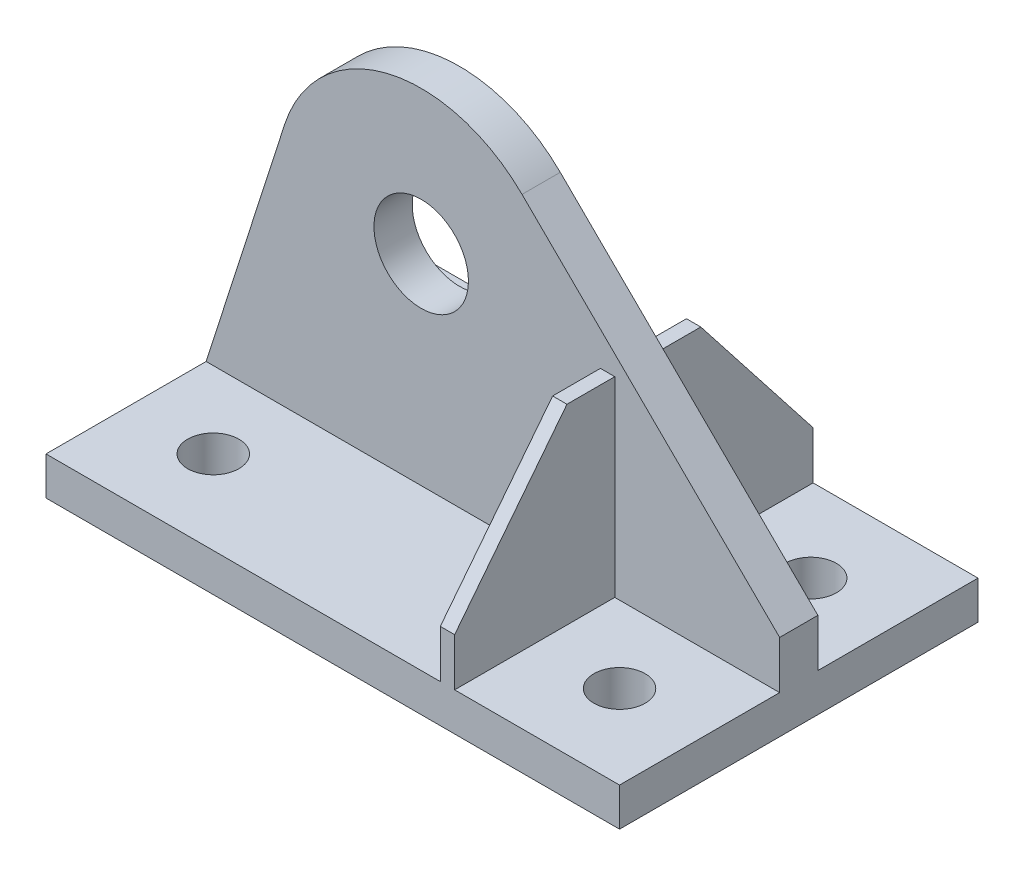
ISO-10303-21;
HEADER;
FILE_DESCRIPTION(('STEP AP214'),'2;1');
FILE_NAME('part.step','',(''),(''),'','','');
FILE_SCHEMA(('AUTOMOTIVE_DESIGN { 1 0 10303 214 1 1 1 1 }'));
ENDSEC;
DATA;
#1=APPLICATION_CONTEXT('core data for automotive mechanical design processes');
#2=APPLICATION_PROTOCOL_DEFINITION('international standard','automotive_design',2000,#1);
#3=PRODUCT_CONTEXT('',#1,'mechanical');
#4=PRODUCT('Part','Part','',(#3));
#5=PRODUCT_RELATED_PRODUCT_CATEGORY('part','',(#4));
#6=PRODUCT_DEFINITION_FORMATION('','',#4);
#7=PRODUCT_DEFINITION_CONTEXT('part definition',#1,'design');
#8=PRODUCT_DEFINITION('design','',#6,#7);
#9=PRODUCT_DEFINITION_SHAPE('','',#8);
#10=(LENGTH_UNIT() NAMED_UNIT(*) SI_UNIT(.MILLI.,.METRE.));
#11=(NAMED_UNIT(*) PLANE_ANGLE_UNIT() SI_UNIT($,.RADIAN.));
#12=(NAMED_UNIT(*) SI_UNIT($,.STERADIAN.) SOLID_ANGLE_UNIT());
#13=UNCERTAINTY_MEASURE_WITH_UNIT(LENGTH_MEASURE(1.E-05),#10,'distance_accuracy_value','');
#14=(GEOMETRIC_REPRESENTATION_CONTEXT(3) GLOBAL_UNCERTAINTY_ASSIGNED_CONTEXT((#13)) GLOBAL_UNIT_ASSIGNED_CONTEXT((#10,
#11,#12)) REPRESENTATION_CONTEXT('',''));
#15=CARTESIAN_POINT('',(0.,0.,0.));
#16=DIRECTION('',(0.,0.,1.));
#17=DIRECTION('',(1.,0.,0.));
#18=AXIS2_PLACEMENT_3D('',#15,#16,#17);
#19=CARTESIAN_POINT('',(0.,16.,0.));
#20=DIRECTION('',(0.,-1.,0.));
#21=DIRECTION('',(0.,0.,-1.));
#22=AXIS2_PLACEMENT_3D('',#19,#20,#21);
#23=PLANE('',#22);
#24=CARTESIAN_POINT('',(35.,16.,-35.));
#25=DIRECTION('',(0.,1.,0.));
#26=DIRECTION('',(0.,0.,1.));
#27=AXIS2_PLACEMENT_3D('',#24,#25,#26);
#28=CIRCLE('',#27,10.7283019020512);
#29=CARTESIAN_POINT('',(35.,16.,-24.2716980979488));
#30=VERTEX_POINT('',#29);
#31=EDGE_CURVE('E275',#30,#30,#28,.T.);
#32=ORIENTED_EDGE('',*,*,#31,.F.);
#33=EDGE_LOOP('',(#32));
#34=FACE_BOUND('',#33,.T.);
#35=DIRECTION('',(1.,0.,0.));
#36=VECTOR('',#35,1.);
#37=CARTESIAN_POINT('',(0.,16.,-67.));
#38=LINE('',#37,#36);
#39=CARTESIAN_POINT('',(0.,16.,-67.));
#40=VERTEX_POINT('',#39);
#41=CARTESIAN_POINT('',(165.,16.,-67.));
#42=VERTEX_POINT('',#41);
#43=EDGE_CURVE('E203',#40,#42,#38,.T.);
#44=ORIENTED_EDGE('',*,*,#43,.F.);
#45=DIRECTION('',(0.,0.,1.));
#46=VECTOR('',#45,1.);
#47=CARTESIAN_POINT('',(0.,16.,0.));
#48=LINE('',#47,#46);
#49=CARTESIAN_POINT('',(0.,16.,0.));
#50=VERTEX_POINT('',#49);
#51=EDGE_CURVE('E270',#40,#50,#48,.T.);
#52=ORIENTED_EDGE('',*,*,#51,.T.);
#53=DIRECTION('',(1.,0.,0.));
#54=VECTOR('',#53,1.);
#55=CARTESIAN_POINT('',(0.,16.,0.));
#56=LINE('',#55,#54);
#57=CARTESIAN_POINT('',(165.,16.,0.));
#58=VERTEX_POINT('',#57);
#59=EDGE_CURVE('E285',#50,#58,#56,.T.);
#60=ORIENTED_EDGE('',*,*,#59,.T.);
#61=DIRECTION('',(0.,0.,1.));
#62=VECTOR('',#61,1.);
#63=CARTESIAN_POINT('',(165.,16.,-150.));
#64=LINE('',#63,#62);
#65=EDGE_CURVE('E232',#42,#58,#64,.T.);
#66=ORIENTED_EDGE('',*,*,#65,.F.);
#67=EDGE_LOOP('',(#44,#52,#60,#66));
#68=FACE_BOUND('',#67,.T.);
#69=ADVANCED_FACE('F34',(#34,#68),#23,.F.);
#70=CARTESIAN_POINT('',(35.,16.,-115.));
#71=DIRECTION('',(0.,1.,0.));
#72=DIRECTION('',(0.,0.,1.));
#73=AXIS2_PLACEMENT_3D('',#70,#71,#72);
#74=CIRCLE('',#73,10.7283019020512);
#75=CARTESIAN_POINT('',(35.,16.,-104.271698097949));
#76=VERTEX_POINT('',#75);
#77=EDGE_CURVE('E296',#76,#76,#74,.T.);
#78=ORIENTED_EDGE('',*,*,#77,.F.);
#79=EDGE_LOOP('',(#78));
#80=FACE_BOUND('',#79,.T.);
#81=DIRECTION('',(-1.,0.,0.));
#82=VECTOR('',#81,1.);
#83=CARTESIAN_POINT('',(0.,16.,-83.));
#84=LINE('',#83,#82);
#85=CARTESIAN_POINT('',(165.,16.,-83.));
#86=VERTEX_POINT('',#85);
#87=CARTESIAN_POINT('',(0.,16.,-83.));
#88=VERTEX_POINT('',#87);
#89=EDGE_CURVE('E205',#86,#88,#84,.T.);
#90=ORIENTED_EDGE('',*,*,#89,.F.);
#91=CARTESIAN_POINT('',(165.,16.,-150.));
#92=VERTEX_POINT('',#91);
#93=EDGE_CURVE('E248',#92,#86,#64,.T.);
#94=ORIENTED_EDGE('',*,*,#93,.F.);
#95=DIRECTION('',(-1.,0.,0.));
#96=VECTOR('',#95,1.);
#97=CARTESIAN_POINT('',(0.,16.,-150.));
#98=LINE('',#97,#96);
#99=CARTESIAN_POINT('',(0.,16.,-150.));
#100=VERTEX_POINT('',#99);
#101=EDGE_CURVE('E321',#92,#100,#98,.T.);
#102=ORIENTED_EDGE('',*,*,#101,.T.);
#103=EDGE_CURVE('E266',#100,#88,#48,.T.);
#104=ORIENTED_EDGE('',*,*,#103,.T.);
#105=EDGE_LOOP('',(#90,#94,#102,#104));
#106=FACE_BOUND('',#105,.T.);
#107=ADVANCED_FACE('F389',(#80,#106),#23,.F.);
#108=CARTESIAN_POINT('',(205.,16.,-35.));
#109=DIRECTION('',(0.,1.,0.));
#110=DIRECTION('',(0.,0.,1.));
#111=AXIS2_PLACEMENT_3D('',#108,#109,#110);
#112=CIRCLE('',#111,10.7283019020512);
#113=CARTESIAN_POINT('',(205.,16.,-24.2716980979488));
#114=VERTEX_POINT('',#113);
#115=EDGE_CURVE('E374',#114,#114,#112,.T.);
#116=ORIENTED_EDGE('',*,*,#115,.F.);
#117=EDGE_LOOP('',(#116));
#118=FACE_BOUND('',#117,.T.);
#119=CARTESIAN_POINT('',(171.,16.,-67.));
#120=VERTEX_POINT('',#119);
#121=CARTESIAN_POINT('',(240.,16.,-67.));
#122=VERTEX_POINT('',#121);
#123=EDGE_CURVE('E202',#120,#122,#38,.T.);
#124=ORIENTED_EDGE('',*,*,#123,.F.);
#125=DIRECTION('',(0.,0.,-1.));
#126=VECTOR('',#125,1.);
#127=CARTESIAN_POINT('',(171.,16.,-150.));
#128=LINE('',#127,#126);
#129=CARTESIAN_POINT('',(171.,16.,0.));
#130=VERTEX_POINT('',#129);
#131=EDGE_CURVE('E364',#130,#120,#128,.T.);
#132=ORIENTED_EDGE('',*,*,#131,.F.);
#133=CARTESIAN_POINT('',(240.,16.,0.));
#134=VERTEX_POINT('',#133);
#135=EDGE_CURVE('E269',#130,#134,#56,.T.);
#136=ORIENTED_EDGE('',*,*,#135,.T.);
#137=DIRECTION('',(0.,0.,-1.));
#138=VECTOR('',#137,1.);
#139=CARTESIAN_POINT('',(240.,16.,0.));
#140=LINE('',#139,#138);
#141=EDGE_CURVE('E279',#134,#122,#140,.T.);
#142=ORIENTED_EDGE('',*,*,#141,.T.);
#143=EDGE_LOOP('',(#124,#132,#136,#142));
#144=FACE_BOUND('',#143,.T.);
#145=ADVANCED_FACE('F433',(#118,#144),#23,.F.);
#146=CARTESIAN_POINT('',(205.,16.,-115.));
#147=DIRECTION('',(0.,1.,0.));
#148=DIRECTION('',(0.,0.,1.));
#149=AXIS2_PLACEMENT_3D('',#146,#147,#148);
#150=CIRCLE('',#149,10.7283019020512);
#151=CARTESIAN_POINT('',(205.,16.,-104.271698097949));
#152=VERTEX_POINT('',#151);
#153=EDGE_CURVE('E289',#152,#152,#150,.T.);
#154=ORIENTED_EDGE('',*,*,#153,.F.);
#155=EDGE_LOOP('',(#154));
#156=FACE_BOUND('',#155,.T.);
#157=CARTESIAN_POINT('',(240.,16.,-83.));
#158=VERTEX_POINT('',#157);
#159=CARTESIAN_POINT('',(171.,16.,-83.));
#160=VERTEX_POINT('',#159);
#161=EDGE_CURVE('E206',#158,#160,#84,.T.);
#162=ORIENTED_EDGE('',*,*,#161,.F.);
#163=CARTESIAN_POINT('',(240.,16.,-150.));
#164=VERTEX_POINT('',#163);
#165=EDGE_CURVE('E288',#158,#164,#140,.T.);
#166=ORIENTED_EDGE('',*,*,#165,.T.);
#167=CARTESIAN_POINT('',(171.,16.,-150.));
#168=VERTEX_POINT('',#167);
#169=EDGE_CURVE('E263',#164,#168,#98,.T.);
#170=ORIENTED_EDGE('',*,*,#169,.T.);
#171=EDGE_CURVE('E254',#160,#168,#128,.T.);
#172=ORIENTED_EDGE('',*,*,#171,.F.);
#173=EDGE_LOOP('',(#162,#166,#170,#172));
#174=FACE_BOUND('',#173,.T.);
#175=ADVANCED_FACE('F338',(#156,#174),#23,.F.);
#176=CARTESIAN_POINT('',(165.,96.,-150.));
#177=DIRECTION('',(1.,0.,0.));
#178=DIRECTION('',(0.,0.,-1.));
#179=AXIS2_PLACEMENT_3D('',#176,#177,#178);
#180=PLANE('',#179);
#181=DIRECTION('',(0.,1.,0.));
#182=VECTOR('',#181,1.);
#183=CARTESIAN_POINT('',(165.,96.,-67.));
#184=LINE('',#183,#182);
#185=CARTESIAN_POINT('',(165.,96.,-67.));
#186=VERTEX_POINT('',#185);
#187=EDGE_CURVE('E216',#42,#186,#184,.T.);
#188=ORIENTED_EDGE('',*,*,#187,.F.);
#189=ORIENTED_EDGE('',*,*,#65,.T.);
#190=DIRECTION('',(0.,-1.,0.));
#191=VECTOR('',#190,1.);
#192=CARTESIAN_POINT('',(165.,96.,0.));
#193=LINE('',#192,#191);
#194=CARTESIAN_POINT('',(165.,36.,0.));
#195=VERTEX_POINT('',#194);
#196=EDGE_CURVE('E354',#195,#58,#193,.T.);
#197=ORIENTED_EDGE('',*,*,#196,.F.);
#198=DIRECTION('',(0.,-0.787228053528989,0.616661975264374));
#199=VECTOR('',#198,1.);
#200=CARTESIAN_POINT('',(165.,96.,-47.));
#201=LINE('',#200,#199);
#202=CARTESIAN_POINT('',(165.,96.,-47.));
#203=VERTEX_POINT('',#202);
#204=EDGE_CURVE('E224',#203,#195,#201,.T.);
#205=ORIENTED_EDGE('',*,*,#204,.F.);
#206=DIRECTION('',(0.,0.,1.));
#207=VECTOR('',#206,1.);
#208=CARTESIAN_POINT('',(165.,96.,-150.));
#209=LINE('',#208,#207);
#210=EDGE_CURVE('E237',#186,#203,#209,.T.);
#211=ORIENTED_EDGE('',*,*,#210,.F.);
#212=EDGE_LOOP('',(#188,#189,#197,#205,#211));
#213=FACE_BOUND('',#212,.T.);
#214=ADVANCED_FACE('F430',(#213),#180,.F.);
#215=DIRECTION('',(0.,-1.,0.));
#216=VECTOR('',#215,1.);
#217=CARTESIAN_POINT('',(165.,96.,-83.));
#218=LINE('',#217,#216);
#219=CARTESIAN_POINT('',(165.,96.,-83.));
#220=VERTEX_POINT('',#219);
#221=EDGE_CURVE('E212',#220,#86,#218,.T.);
#222=ORIENTED_EDGE('',*,*,#221,.F.);
#223=CARTESIAN_POINT('',(165.,96.,-103.));
#224=VERTEX_POINT('',#223);
#225=EDGE_CURVE('E233',#224,#220,#209,.T.);
#226=ORIENTED_EDGE('',*,*,#225,.F.);
#227=DIRECTION('',(0.,0.787228053528989,0.616661975264374));
#228=VECTOR('',#227,1.);
#229=CARTESIAN_POINT('',(165.,96.,-103.));
#230=LINE('',#229,#228);
#231=CARTESIAN_POINT('',(165.,36.,-150.));
#232=VERTEX_POINT('',#231);
#233=EDGE_CURVE('E58',#232,#224,#230,.T.);
#234=ORIENTED_EDGE('',*,*,#233,.F.);
#235=DIRECTION('',(0.,-1.,0.));
#236=VECTOR('',#235,1.);
#237=CARTESIAN_POINT('',(165.,96.,-150.));
#238=LINE('',#237,#236);
#239=EDGE_CURVE('E241',#232,#92,#238,.T.);
#240=ORIENTED_EDGE('',*,*,#239,.T.);
#241=ORIENTED_EDGE('',*,*,#93,.T.);
#242=EDGE_LOOP('',(#222,#226,#234,#240,#241));
#243=FACE_BOUND('',#242,.T.);
#244=ADVANCED_FACE('F413',(#243),#180,.F.);
#245=CARTESIAN_POINT('',(171.,96.,-150.));
#246=DIRECTION('',(-1.,0.,0.));
#247=DIRECTION('',(0.,0.,1.));
#248=AXIS2_PLACEMENT_3D('',#245,#246,#247);
#249=PLANE('',#248);
#250=DIRECTION('',(0.,-1.,0.));
#251=VECTOR('',#250,1.);
#252=CARTESIAN_POINT('',(171.,96.,-67.));
#253=LINE('',#252,#251);
#254=CARTESIAN_POINT('',(171.,96.,-67.));
#255=VERTEX_POINT('',#254);
#256=EDGE_CURVE('E214',#255,#120,#253,.T.);
#257=ORIENTED_EDGE('',*,*,#256,.F.);
#258=DIRECTION('',(0.,0.,-1.));
#259=VECTOR('',#258,1.);
#260=CARTESIAN_POINT('',(171.,96.,-150.));
#261=LINE('',#260,#259);
#262=CARTESIAN_POINT('',(171.,96.,-47.));
#263=VERTEX_POINT('',#262);
#264=EDGE_CURVE('E238',#263,#255,#261,.T.);
#265=ORIENTED_EDGE('',*,*,#264,.F.);
#266=DIRECTION('',(0.,-0.787228053528989,0.616661975264374));
#267=VECTOR('',#266,1.);
#268=CARTESIAN_POINT('',(171.,146.00172146669,-86.1680151489069));
#269=LINE('',#268,#267);
#270=CARTESIAN_POINT('',(171.,36.,0.));
#271=VERTEX_POINT('',#270);
#272=EDGE_CURVE('E229',#263,#271,#269,.T.);
#273=ORIENTED_EDGE('',*,*,#272,.T.);
#274=DIRECTION('',(0.,-1.,0.));
#275=VECTOR('',#274,1.);
#276=CARTESIAN_POINT('',(171.,96.,0.));
#277=LINE('',#276,#275);
#278=EDGE_CURVE('E352',#271,#130,#277,.T.);
#279=ORIENTED_EDGE('',*,*,#278,.T.);
#280=ORIENTED_EDGE('',*,*,#131,.T.);
#281=EDGE_LOOP('',(#257,#265,#273,#279,#280));
#282=FACE_BOUND('',#281,.T.);
#283=ADVANCED_FACE('F432',(#282),#249,.F.);
#284=DIRECTION('',(0.,1.,0.));
#285=VECTOR('',#284,1.);
#286=CARTESIAN_POINT('',(171.,96.,-83.));
#287=LINE('',#286,#285);
#288=CARTESIAN_POINT('',(171.,96.,-83.));
#289=VERTEX_POINT('',#288);
#290=EDGE_CURVE('E50',#160,#289,#287,.T.);
#291=ORIENTED_EDGE('',*,*,#290,.F.);
#292=ORIENTED_EDGE('',*,*,#171,.T.);
#293=DIRECTION('',(0.,-1.,0.));
#294=VECTOR('',#293,1.);
#295=CARTESIAN_POINT('',(171.,96.,-150.));
#296=LINE('',#295,#294);
#297=CARTESIAN_POINT('',(171.,36.,-150.));
#298=VERTEX_POINT('',#297);
#299=EDGE_CURVE('E350',#298,#168,#296,.T.);
#300=ORIENTED_EDGE('',*,*,#299,.F.);
#301=DIRECTION('',(0.,0.787228053528989,0.616661975264374));
#302=VECTOR('',#301,1.);
#303=CARTESIAN_POINT('',(171.,73.1836804957824,-120.872783611637));
#304=LINE('',#303,#302);
#305=CARTESIAN_POINT('',(171.,96.,-103.));
#306=VERTEX_POINT('',#305);
#307=EDGE_CURVE('E221',#298,#306,#304,.T.);
#308=ORIENTED_EDGE('',*,*,#307,.T.);
#309=EDGE_CURVE('E236',#289,#306,#261,.T.);
#310=ORIENTED_EDGE('',*,*,#309,.F.);
#311=EDGE_LOOP('',(#291,#292,#300,#308,#310));
#312=FACE_BOUND('',#311,.T.);
#313=ADVANCED_FACE('F483',(#312),#249,.F.);
#314=CARTESIAN_POINT('',(0.,96.,0.));
#315=DIRECTION('',(0.,1.,0.));
#316=DIRECTION('',(0.,0.,1.));
#317=AXIS2_PLACEMENT_3D('',#314,#315,#316);
#318=PLANE('',#317);
#319=ORIENTED_EDGE('',*,*,#264,.T.);
#320=DIRECTION('',(-1.,0.,0.));
#321=VECTOR('',#320,1.);
#322=CARTESIAN_POINT('',(0.,96.,-67.));
#323=LINE('',#322,#321);
#324=EDGE_CURVE('E258',#255,#186,#323,.T.);
#325=ORIENTED_EDGE('',*,*,#324,.T.);
#326=ORIENTED_EDGE('',*,*,#210,.T.);
#327=DIRECTION('',(-1.,0.,0.));
#328=VECTOR('',#327,1.);
#329=CARTESIAN_POINT('',(0.,96.,-47.));
#330=LINE('',#329,#328);
#331=EDGE_CURVE('E292',#263,#203,#330,.T.);
#332=ORIENTED_EDGE('',*,*,#331,.F.);
#333=EDGE_LOOP('',(#319,#325,#326,#332));
#334=FACE_BOUND('',#333,.T.);
#335=ADVANCED_FACE('F424',(#334),#318,.T.);
#336=ORIENTED_EDGE('',*,*,#225,.T.);
#337=DIRECTION('',(1.,0.,0.));
#338=VECTOR('',#337,1.);
#339=CARTESIAN_POINT('',(0.,96.,-83.));
#340=LINE('',#339,#338);
#341=EDGE_CURVE('E431',#220,#289,#340,.T.);
#342=ORIENTED_EDGE('',*,*,#341,.T.);
#343=ORIENTED_EDGE('',*,*,#309,.T.);
#344=DIRECTION('',(1.,0.,0.));
#345=VECTOR('',#344,1.);
#346=CARTESIAN_POINT('',(0.,96.,-103.));
#347=LINE('',#346,#345);
#348=EDGE_CURVE('E359',#224,#306,#347,.T.);
#349=ORIENTED_EDGE('',*,*,#348,.F.);
#350=EDGE_LOOP('',(#336,#342,#343,#349));
#351=FACE_BOUND('',#350,.T.);
#352=ADVANCED_FACE('F455',(#351),#318,.T.);
#353=CARTESIAN_POINT('',(0.,16.,0.));
#354=DIRECTION('',(1.,0.,0.));
#355=DIRECTION('',(0.,0.,-1.));
#356=AXIS2_PLACEMENT_3D('',#353,#354,#355);
#357=PLANE('',#356);
#358=ORIENTED_EDGE('',*,*,#51,.F.);
#359=DIRECTION('',(0.,0.,1.));
#360=VECTOR('',#359,1.);
#361=CARTESIAN_POINT('',(0.,16.,-150.00005));
#362=LINE('',#361,#360);
#363=EDGE_CURVE('E197',#88,#40,#362,.T.);
#364=ORIENTED_EDGE('',*,*,#363,.F.);
#365=ORIENTED_EDGE('',*,*,#103,.F.);
#366=DIRECTION('',(0.,-1.,0.));
#367=VECTOR('',#366,1.);
#368=CARTESIAN_POINT('',(0.,16.,-150.));
#369=LINE('',#368,#367);
#370=CARTESIAN_POINT('',(0.,0.,-150.));
#371=VERTEX_POINT('',#370);
#372=EDGE_CURVE('E259',#100,#371,#369,.T.);
#373=ORIENTED_EDGE('',*,*,#372,.T.);
#374=DIRECTION('',(0.,0.,1.));
#375=VECTOR('',#374,1.);
#376=CARTESIAN_POINT('',(0.,0.,0.));
#377=LINE('',#376,#375);
#378=CARTESIAN_POINT('',(0.,0.,0.));
#379=VERTEX_POINT('',#378);
#380=EDGE_CURVE('E315',#371,#379,#377,.T.);
#381=ORIENTED_EDGE('',*,*,#380,.T.);
#382=DIRECTION('',(0.,-1.,0.));
#383=VECTOR('',#382,1.);
#384=CARTESIAN_POINT('',(0.,16.,0.));
#385=LINE('',#384,#383);
#386=EDGE_CURVE('E302',#50,#379,#385,.T.);
#387=ORIENTED_EDGE('',*,*,#386,.F.);
#388=EDGE_LOOP('',(#358,#364,#365,#373,#381,#387));
#389=FACE_BOUND('',#388,.T.);
#390=ADVANCED_FACE('F398',(#389),#357,.F.);
#391=CARTESIAN_POINT('',(0.,16.,0.));
#392=DIRECTION('',(0.,0.,-1.));
#393=DIRECTION('',(-1.,0.,0.));
#394=AXIS2_PLACEMENT_3D('',#391,#392,#393);
#395=PLANE('',#394);
#396=ORIENTED_EDGE('',*,*,#278,.F.);
#397=DIRECTION('',(-1.,0.,0.));
#398=VECTOR('',#397,1.);
#399=CARTESIAN_POINT('',(240.000025,36.,0.));
#400=LINE('',#399,#398);
#401=EDGE_CURVE('E226',#271,#195,#400,.T.);
#402=ORIENTED_EDGE('',*,*,#401,.T.);
#403=ORIENTED_EDGE('',*,*,#196,.T.);
#404=ORIENTED_EDGE('',*,*,#59,.F.);
#405=ORIENTED_EDGE('',*,*,#386,.T.);
#406=DIRECTION('',(1.,0.,0.));
#407=VECTOR('',#406,1.);
#408=CARTESIAN_POINT('',(0.,0.,0.));
#409=LINE('',#408,#407);
#410=CARTESIAN_POINT('',(240.,0.,0.));
#411=VERTEX_POINT('',#410);
#412=EDGE_CURVE('E313',#379,#411,#409,.T.);
#413=ORIENTED_EDGE('',*,*,#412,.T.);
#414=DIRECTION('',(0.,-1.,0.));
#415=VECTOR('',#414,1.);
#416=CARTESIAN_POINT('',(240.,16.,0.));
#417=LINE('',#416,#415);
#418=EDGE_CURVE('E305',#134,#411,#417,.T.);
#419=ORIENTED_EDGE('',*,*,#418,.F.);
#420=ORIENTED_EDGE('',*,*,#135,.F.);
#421=EDGE_LOOP('',(#396,#402,#403,#404,#405,#413,#419,#420));
#422=FACE_BOUND('',#421,.T.);
#423=ADVANCED_FACE('F403',(#422),#395,.F.);
#424=CARTESIAN_POINT('',(240.,16.,0.));
#425=DIRECTION('',(-1.,0.,0.));
#426=DIRECTION('',(0.,0.,1.));
#427=AXIS2_PLACEMENT_3D('',#424,#425,#426);
#428=PLANE('',#427);
#429=DIRECTION('',(0.,-1.,0.));
#430=VECTOR('',#429,1.);
#431=CARTESIAN_POINT('',(240.,160.,-83.));
#432=LINE('',#431,#430);
#433=CARTESIAN_POINT('',(240.,36.,-83.));
#434=VERTEX_POINT('',#433);
#435=EDGE_CURVE('E208',#434,#158,#432,.T.);
#436=ORIENTED_EDGE('',*,*,#435,.F.);
#437=DIRECTION('',(0.,0.,1.));
#438=VECTOR('',#437,1.);
#439=CARTESIAN_POINT('',(240.,36.,-150.00025));
#440=LINE('',#439,#438);
#441=CARTESIAN_POINT('',(240.,36.,-67.));
#442=VERTEX_POINT('',#441);
#443=EDGE_CURVE('E178',#434,#442,#440,.T.);
#444=ORIENTED_EDGE('',*,*,#443,.T.);
#445=DIRECTION('',(0.,-1.,0.));
#446=VECTOR('',#445,1.);
#447=CARTESIAN_POINT('',(240.,160.,-67.));
#448=LINE('',#447,#446);
#449=EDGE_CURVE('E189',#442,#122,#448,.T.);
#450=ORIENTED_EDGE('',*,*,#449,.T.);
#451=ORIENTED_EDGE('',*,*,#141,.F.);
#452=ORIENTED_EDGE('',*,*,#418,.T.);
#453=DIRECTION('',(0.,0.,-1.));
#454=VECTOR('',#453,1.);
#455=CARTESIAN_POINT('',(240.,0.,0.));
#456=LINE('',#455,#454);
#457=CARTESIAN_POINT('',(240.,0.,-150.));
#458=VERTEX_POINT('',#457);
#459=EDGE_CURVE('E311',#411,#458,#456,.T.);
#460=ORIENTED_EDGE('',*,*,#459,.T.);
#461=DIRECTION('',(0.,-1.,0.));
#462=VECTOR('',#461,1.);
#463=CARTESIAN_POINT('',(240.,16.,-150.));
#464=LINE('',#463,#462);
#465=EDGE_CURVE('E262',#164,#458,#464,.T.);
#466=ORIENTED_EDGE('',*,*,#465,.F.);
#467=ORIENTED_EDGE('',*,*,#165,.F.);
#468=EDGE_LOOP('',(#436,#444,#450,#451,#452,#460,#466,#467));
#469=FACE_BOUND('',#468,.T.);
#470=ADVANCED_FACE('F341',(#469),#428,.F.);
#471=CARTESIAN_POINT('',(0.,16.,-150.));
#472=DIRECTION('',(0.,0.,1.));
#473=DIRECTION('',(1.,0.,0.));
#474=AXIS2_PLACEMENT_3D('',#471,#472,#473);
#475=PLANE('',#474);
#476=ORIENTED_EDGE('',*,*,#239,.F.);
#477=DIRECTION('',(-1.,0.,0.));
#478=VECTOR('',#477,1.);
#479=CARTESIAN_POINT('',(240.000025,36.,-150.));
#480=LINE('',#479,#478);
#481=EDGE_CURVE('E219',#298,#232,#480,.T.);
#482=ORIENTED_EDGE('',*,*,#481,.F.);
#483=ORIENTED_EDGE('',*,*,#299,.T.);
#484=ORIENTED_EDGE('',*,*,#169,.F.);
#485=ORIENTED_EDGE('',*,*,#465,.T.);
#486=DIRECTION('',(-1.,0.,0.));
#487=VECTOR('',#486,1.);
#488=CARTESIAN_POINT('',(0.,0.,-150.));
#489=LINE('',#488,#487);
#490=EDGE_CURVE('E274',#458,#371,#489,.T.);
#491=ORIENTED_EDGE('',*,*,#490,.T.);
#492=ORIENTED_EDGE('',*,*,#372,.F.);
#493=ORIENTED_EDGE('',*,*,#101,.F.);
#494=EDGE_LOOP('',(#476,#482,#483,#484,#485,#491,#492,#493));
#495=FACE_BOUND('',#494,.T.);
#496=ADVANCED_FACE('F347',(#495),#475,.F.);
#497=CARTESIAN_POINT('',(0.,0.,0.));
#498=DIRECTION('',(0.,-1.,0.));
#499=DIRECTION('',(0.,0.,-1.));
#500=AXIS2_PLACEMENT_3D('',#497,#498,#499);
#501=PLANE('',#500);
#502=CARTESIAN_POINT('',(205.,0.,-35.));
#503=DIRECTION('',(0.,1.,0.));
#504=DIRECTION('',(0.,0.,1.));
#505=AXIS2_PLACEMENT_3D('',#502,#503,#504);
#506=CIRCLE('',#505,10.7283019020512);
#507=CARTESIAN_POINT('',(205.,0.,-24.2716980979488));
#508=VERTEX_POINT('',#507);
#509=EDGE_CURVE('E369',#508,#508,#506,.T.);
#510=ORIENTED_EDGE('',*,*,#509,.T.);
#511=EDGE_LOOP('',(#510));
#512=FACE_BOUND('',#511,.T.);
#513=CARTESIAN_POINT('',(35.,0.,-35.));
#514=DIRECTION('',(0.,1.,0.));
#515=DIRECTION('',(0.,0.,1.));
#516=AXIS2_PLACEMENT_3D('',#513,#514,#515);
#517=CIRCLE('',#516,10.7283019020512);
#518=CARTESIAN_POINT('',(35.,0.,-24.2716980979488));
#519=VERTEX_POINT('',#518);
#520=EDGE_CURVE('E317',#519,#519,#517,.T.);
#521=ORIENTED_EDGE('',*,*,#520,.T.);
#522=EDGE_LOOP('',(#521));
#523=FACE_BOUND('',#522,.T.);
#524=ORIENTED_EDGE('',*,*,#380,.F.);
#525=ORIENTED_EDGE('',*,*,#490,.F.);
#526=ORIENTED_EDGE('',*,*,#459,.F.);
#527=ORIENTED_EDGE('',*,*,#412,.F.);
#528=EDGE_LOOP('',(#524,#525,#526,#527));
#529=FACE_BOUND('',#528,.T.);
#530=CARTESIAN_POINT('',(35.,0.,-115.));
#531=DIRECTION('',(0.,1.,0.));
#532=DIRECTION('',(0.,0.,1.));
#533=AXIS2_PLACEMENT_3D('',#530,#531,#532);
#534=CIRCLE('',#533,10.7283019020512);
#535=CARTESIAN_POINT('',(35.,0.,-104.271698097949));
#536=VERTEX_POINT('',#535);
#537=EDGE_CURVE('E299',#536,#536,#534,.T.);
#538=ORIENTED_EDGE('',*,*,#537,.T.);
#539=EDGE_LOOP('',(#538));
#540=FACE_BOUND('',#539,.T.);
#541=CARTESIAN_POINT('',(205.,0.,-115.));
#542=DIRECTION('',(0.,1.,0.));
#543=DIRECTION('',(0.,0.,1.));
#544=AXIS2_PLACEMENT_3D('',#541,#542,#543);
#545=CIRCLE('',#544,10.7283019020512);
#546=CARTESIAN_POINT('',(205.,0.,-104.271698097949));
#547=VERTEX_POINT('',#546);
#548=EDGE_CURVE('E293',#547,#547,#545,.T.);
#549=ORIENTED_EDGE('',*,*,#548,.T.);
#550=EDGE_LOOP('',(#549));
#551=FACE_BOUND('',#550,.T.);
#552=ADVANCED_FACE('F407',(#512,#523,#529,#540,#551),#501,.T.);
#553=CARTESIAN_POINT('',(35.,0.,-35.));
#554=DIRECTION('',(0.,1.,0.));
#555=DIRECTION('',(0.,0.,1.));
#556=AXIS2_PLACEMENT_3D('',#553,#554,#555);
#557=CYLINDRICAL_SURFACE('',#556,10.7283019020512);
#558=ORIENTED_EDGE('',*,*,#520,.F.);
#559=EDGE_LOOP('',(#558));
#560=FACE_BOUND('',#559,.T.);
#561=ORIENTED_EDGE('',*,*,#31,.T.);
#562=EDGE_LOOP('',(#561));
#563=FACE_BOUND('',#562,.T.);
#564=ADVANCED_FACE('F385',(#560,#563),#557,.F.);
#565=CARTESIAN_POINT('',(205.,0.,-35.));
#566=DIRECTION('',(0.,1.,0.));
#567=DIRECTION('',(0.,0.,1.));
#568=AXIS2_PLACEMENT_3D('',#565,#566,#567);
#569=CYLINDRICAL_SURFACE('',#568,10.7283019020512);
#570=ORIENTED_EDGE('',*,*,#509,.F.);
#571=EDGE_LOOP('',(#570));
#572=FACE_BOUND('',#571,.T.);
#573=ORIENTED_EDGE('',*,*,#115,.T.);
#574=EDGE_LOOP('',(#573));
#575=FACE_BOUND('',#574,.T.);
#576=ADVANCED_FACE('F458',(#572,#575),#569,.F.);
#577=CARTESIAN_POINT('',(35.,0.,-115.));
#578=DIRECTION('',(0.,1.,0.));
#579=DIRECTION('',(0.,0.,1.));
#580=AXIS2_PLACEMENT_3D('',#577,#578,#579);
#581=CYLINDRICAL_SURFACE('',#580,10.7283019020512);
#582=ORIENTED_EDGE('',*,*,#537,.F.);
#583=EDGE_LOOP('',(#582));
#584=FACE_BOUND('',#583,.T.);
#585=ORIENTED_EDGE('',*,*,#77,.T.);
#586=EDGE_LOOP('',(#585));
#587=FACE_BOUND('',#586,.T.);
#588=ADVANCED_FACE('F456',(#584,#587),#581,.F.);
#589=CARTESIAN_POINT('',(205.,0.,-115.));
#590=DIRECTION('',(0.,1.,0.));
#591=DIRECTION('',(0.,0.,1.));
#592=AXIS2_PLACEMENT_3D('',#589,#590,#591);
#593=CYLINDRICAL_SURFACE('',#592,10.7283019020512);
#594=ORIENTED_EDGE('',*,*,#548,.F.);
#595=EDGE_LOOP('',(#594));
#596=FACE_BOUND('',#595,.T.);
#597=ORIENTED_EDGE('',*,*,#153,.T.);
#598=EDGE_LOOP('',(#597));
#599=FACE_BOUND('',#598,.T.);
#600=ADVANCED_FACE('F36',(#596,#599),#593,.F.);
#601=CARTESIAN_POINT('',(240.000025,96.,-47.));
#602=DIRECTION('',(0.,-0.616661975264374,-0.787228053528989));
#603=DIRECTION('',(0.,0.787228053528989,-0.616661975264374));
#604=AXIS2_PLACEMENT_3D('',#601,#602,#603);
#605=PLANE('',#604);
#606=ORIENTED_EDGE('',*,*,#331,.T.);
#607=ORIENTED_EDGE('',*,*,#204,.T.);
#608=ORIENTED_EDGE('',*,*,#401,.F.);
#609=ORIENTED_EDGE('',*,*,#272,.F.);
#610=EDGE_LOOP('',(#606,#607,#608,#609));
#611=FACE_BOUND('',#610,.T.);
#612=ADVANCED_FACE('F429',(#611),#605,.F.);
#613=CARTESIAN_POINT('',(240.000025,96.,-103.));
#614=DIRECTION('',(0.,-0.616661975264374,0.787228053528989));
#615=DIRECTION('',(0.,-0.787228053528989,-0.616661975264374));
#616=AXIS2_PLACEMENT_3D('',#613,#614,#615);
#617=PLANE('',#616);
#618=ORIENTED_EDGE('',*,*,#481,.T.);
#619=ORIENTED_EDGE('',*,*,#233,.T.);
#620=ORIENTED_EDGE('',*,*,#348,.T.);
#621=ORIENTED_EDGE('',*,*,#307,.F.);
#622=EDGE_LOOP('',(#618,#619,#620,#621));
#623=FACE_BOUND('',#622,.T.);
#624=ADVANCED_FACE('F488',(#623),#617,.F.);
#625=CARTESIAN_POINT('',(0.,160.,-67.));
#626=DIRECTION('',(0.,0.,-1.));
#627=DIRECTION('',(-1.,0.,0.));
#628=AXIS2_PLACEMENT_3D('',#625,#626,#627);
#629=PLANE('',#628);
#630=CARTESIAN_POINT('',(90.,100.,-67.));
#631=DIRECTION('',(0.,0.,1.));
#632=DIRECTION('',(1.,0.,0.));
#633=AXIS2_PLACEMENT_3D('',#630,#631,#632);
#634=CIRCLE('',#633,19.7662272726515);
#635=CARTESIAN_POINT('',(109.766227272651,100.,-67.));
#636=VERTEX_POINT('',#635);
#637=EDGE_CURVE('E192',#636,#636,#634,.T.);
#638=ORIENTED_EDGE('',*,*,#637,.F.);
#639=EDGE_LOOP('',(#638));
#640=FACE_BOUND('',#639,.T.);
#641=DIRECTION('',(0.710883144259319,-0.703310141550643,0.));
#642=VECTOR('',#641,1.);
#643=CARTESIAN_POINT('',(132.198608493039,142.652988655559,-67.));
#644=LINE('',#643,#642);
#645=CARTESIAN_POINT('',(132.198608493039,142.652988655559,-67.));
#646=VERTEX_POINT('',#645);
#647=EDGE_CURVE('E183',#646,#442,#644,.T.);
#648=ORIENTED_EDGE('',*,*,#647,.F.);
#649=CARTESIAN_POINT('',(90.,100.,-67.));
#650=DIRECTION('',(0.,0.,-1.));
#651=DIRECTION('',(1.,0.,0.));
#652=AXIS2_PLACEMENT_3D('',#649,#650,#651);
#653=CIRCLE('',#652,60.);
#654=CARTESIAN_POINT('',(32.8744959419908,118.348754347867,-67.));
#655=VERTEX_POINT('',#654);
#656=EDGE_CURVE('E167',#655,#646,#653,.T.);
#657=ORIENTED_EDGE('',*,*,#656,.F.);
#658=DIRECTION('',(0.305812572464451,0.952091734300154,0.));
#659=VECTOR('',#658,1.);
#660=CARTESIAN_POINT('',(32.8744959419908,118.348754347867,-67.));
#661=LINE('',#660,#659);
#662=EDGE_CURVE('E177',#40,#655,#661,.T.);
#663=ORIENTED_EDGE('',*,*,#662,.F.);
#664=ORIENTED_EDGE('',*,*,#43,.T.);
#665=ORIENTED_EDGE('',*,*,#187,.T.);
#666=ORIENTED_EDGE('',*,*,#324,.F.);
#667=ORIENTED_EDGE('',*,*,#256,.T.);
#668=ORIENTED_EDGE('',*,*,#123,.T.);
#669=ORIENTED_EDGE('',*,*,#449,.F.);
#670=EDGE_LOOP('',(#648,#657,#663,#664,#665,#666,#667,#668,#669));
#671=FACE_BOUND('',#670,.T.);
#672=ADVANCED_FACE('F187',(#640,#671),#629,.F.);
#673=CARTESIAN_POINT('',(0.,160.,-83.));
#674=DIRECTION('',(0.,0.,1.));
#675=DIRECTION('',(1.,0.,0.));
#676=AXIS2_PLACEMENT_3D('',#673,#674,#675);
#677=PLANE('',#676);
#678=CARTESIAN_POINT('',(90.,100.,-83.));
#679=DIRECTION('',(0.,0.,1.));
#680=DIRECTION('',(1.,0.,0.));
#681=AXIS2_PLACEMENT_3D('',#678,#679,#680);
#682=CIRCLE('',#681,19.7662272726515);
#683=CARTESIAN_POINT('',(109.766227272651,100.,-83.));
#684=VERTEX_POINT('',#683);
#685=EDGE_CURVE('E38',#684,#684,#682,.T.);
#686=ORIENTED_EDGE('',*,*,#685,.T.);
#687=EDGE_LOOP('',(#686));
#688=FACE_BOUND('',#687,.T.);
#689=CARTESIAN_POINT('',(90.,100.,-83.));
#690=DIRECTION('',(0.,0.,1.));
#691=DIRECTION('',(1.,0.,0.));
#692=AXIS2_PLACEMENT_3D('',#689,#690,#691);
#693=CIRCLE('',#692,60.);
#694=CARTESIAN_POINT('',(32.8744959419908,118.348754347867,-83.));
#695=VERTEX_POINT('',#694);
#696=CARTESIAN_POINT('',(132.198608493039,142.652988655559,-83.));
#697=VERTEX_POINT('',#696);
#698=EDGE_CURVE('E199',#695,#697,#693,.F.);
#699=ORIENTED_EDGE('',*,*,#698,.T.);
#700=DIRECTION('',(0.710883144259319,-0.703310141550643,0.));
#701=VECTOR('',#700,1.);
#702=CARTESIAN_POINT('',(56.7183929728579,217.329117201387,-83.));
#703=LINE('',#702,#701);
#704=EDGE_CURVE('E11',#697,#434,#703,.T.);
#705=ORIENTED_EDGE('',*,*,#704,.T.);
#706=ORIENTED_EDGE('',*,*,#435,.T.);
#707=ORIENTED_EDGE('',*,*,#161,.T.);
#708=ORIENTED_EDGE('',*,*,#290,.T.);
#709=ORIENTED_EDGE('',*,*,#341,.F.);
#710=ORIENTED_EDGE('',*,*,#221,.T.);
#711=ORIENTED_EDGE('',*,*,#89,.T.);
#712=DIRECTION('',(0.305812572464451,0.952091734300154,0.));
#713=VECTOR('',#712,1.);
#714=CARTESIAN_POINT('',(41.9272736383398,146.532928555265,-83.));
#715=LINE('',#714,#713);
#716=EDGE_CURVE('E43',#88,#695,#715,.T.);
#717=ORIENTED_EDGE('',*,*,#716,.T.);
#718=EDGE_LOOP('',(#699,#705,#706,#707,#708,#709,#710,#711,#717));
#719=FACE_BOUND('',#718,.T.);
#720=ADVANCED_FACE('F493',(#688,#719),#677,.F.);
#721=CARTESIAN_POINT('',(32.8744959419908,118.348754347867,-150.00005));
#722=DIRECTION('',(0.952091734300154,-0.305812572464451,0.));
#723=DIRECTION('',(0.305812572464451,0.952091734300154,0.));
#724=AXIS2_PLACEMENT_3D('',#721,#722,#723);
#725=PLANE('',#724);
#726=ORIENTED_EDGE('',*,*,#363,.T.);
#727=ORIENTED_EDGE('',*,*,#662,.T.);
#728=DIRECTION('',(0.,0.,1.));
#729=VECTOR('',#728,1.);
#730=CARTESIAN_POINT('',(32.8744959419908,118.348754347867,-150.00005));
#731=LINE('',#730,#729);
#732=EDGE_CURVE('E172',#695,#655,#731,.T.);
#733=ORIENTED_EDGE('',*,*,#732,.F.);
#734=ORIENTED_EDGE('',*,*,#716,.F.);
#735=EDGE_LOOP('',(#726,#727,#733,#734));
#736=FACE_BOUND('',#735,.T.);
#737=ADVANCED_FACE('F497',(#736),#725,.F.);
#738=CARTESIAN_POINT('',(90.,100.,-150.00005));
#739=DIRECTION('',(0.,0.,1.));
#740=DIRECTION('',(1.,0.,0.));
#741=AXIS2_PLACEMENT_3D('',#738,#739,#740);
#742=CYLINDRICAL_SURFACE('',#741,60.);
#743=ORIENTED_EDGE('',*,*,#732,.T.);
#744=ORIENTED_EDGE('',*,*,#656,.T.);
#745=DIRECTION('',(0.,0.,1.));
#746=VECTOR('',#745,1.);
#747=CARTESIAN_POINT('',(132.198608493039,142.652988655559,-150.00025));
#748=LINE('',#747,#746);
#749=EDGE_CURVE('E170',#697,#646,#748,.T.);
#750=ORIENTED_EDGE('',*,*,#749,.F.);
#751=ORIENTED_EDGE('',*,*,#698,.F.);
#752=EDGE_LOOP('',(#743,#744,#750,#751));
#753=FACE_BOUND('',#752,.T.);
#754=ADVANCED_FACE('F169',(#753),#742,.T.);
#755=CARTESIAN_POINT('',(132.198608493039,142.652988655559,-150.00025));
#756=DIRECTION('',(-0.703310141550643,-0.710883144259319,0.));
#757=DIRECTION('',(0.710883144259319,-0.703310141550643,0.));
#758=AXIS2_PLACEMENT_3D('',#755,#756,#757);
#759=PLANE('',#758);
#760=ORIENTED_EDGE('',*,*,#749,.T.);
#761=ORIENTED_EDGE('',*,*,#647,.T.);
#762=ORIENTED_EDGE('',*,*,#443,.F.);
#763=ORIENTED_EDGE('',*,*,#704,.F.);
#764=EDGE_LOOP('',(#760,#761,#762,#763));
#765=FACE_BOUND('',#764,.T.);
#766=ADVANCED_FACE('F182',(#765),#759,.F.);
#767=CARTESIAN_POINT('',(90.,100.,-150.00025));
#768=DIRECTION('',(0.,0.,1.));
#769=DIRECTION('',(1.,0.,0.));
#770=AXIS2_PLACEMENT_3D('',#767,#768,#769);
#771=CYLINDRICAL_SURFACE('',#770,19.7662272726515);
#772=ORIENTED_EDGE('',*,*,#637,.T.);
#773=EDGE_LOOP('',(#772));
#774=FACE_BOUND('',#773,.T.);
#775=ORIENTED_EDGE('',*,*,#685,.F.);
#776=EDGE_LOOP('',(#775));
#777=FACE_BOUND('',#776,.T.);
#778=ADVANCED_FACE('F506',(#774,#777),#771,.F.);
#779=CLOSED_SHELL('',(#69,#107,#145,#175,#214,#244,#283,#313,#335,#352,#390,#423,#470,#496,#552,
#564,#576,#588,#600,#612,#624,#672,#720,#737,#754,#766,#778));
#780=MANIFOLD_SOLID_BREP('B2',#779);
#781=ADVANCED_BREP_SHAPE_REPRESENTATION('',(#18,#780),#14);
#782=SHAPE_DEFINITION_REPRESENTATION(#9,#781);
ENDSEC;
END-ISO-10303-21;
